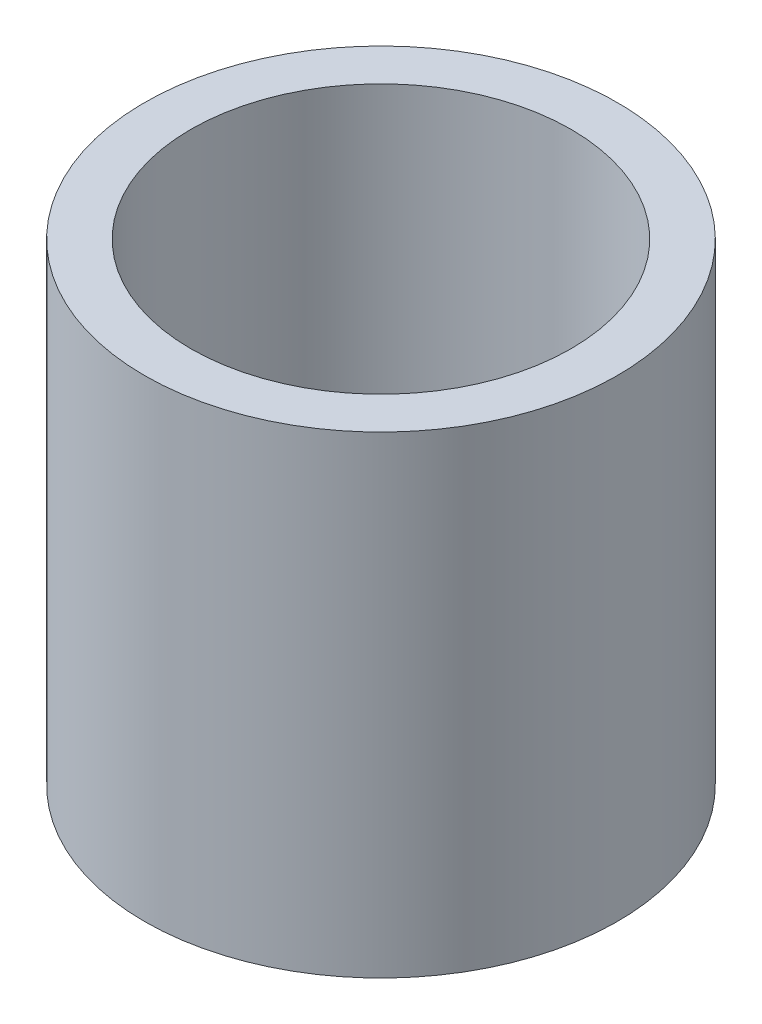
ISO-10303-21;
HEADER;
FILE_DESCRIPTION(('STEP AP214'),'2;1');
FILE_NAME('part.step','',(''),(''),'','','');
FILE_SCHEMA(('AUTOMOTIVE_DESIGN { 1 0 10303 214 1 1 1 1 }'));
ENDSEC;
DATA;
#1=APPLICATION_CONTEXT('core data for automotive mechanical design processes');
#2=APPLICATION_PROTOCOL_DEFINITION('international standard','automotive_design',2000,#1);
#3=PRODUCT_CONTEXT('',#1,'mechanical');
#4=PRODUCT('Part','Part','',(#3));
#5=PRODUCT_RELATED_PRODUCT_CATEGORY('part','',(#4));
#6=PRODUCT_DEFINITION_FORMATION('','',#4);
#7=PRODUCT_DEFINITION_CONTEXT('part definition',#1,'design');
#8=PRODUCT_DEFINITION('design','',#6,#7);
#9=PRODUCT_DEFINITION_SHAPE('','',#8);
#10=(LENGTH_UNIT() NAMED_UNIT(*) SI_UNIT(.MILLI.,.METRE.));
#11=(NAMED_UNIT(*) PLANE_ANGLE_UNIT() SI_UNIT($,.RADIAN.));
#12=(NAMED_UNIT(*) SI_UNIT($,.STERADIAN.) SOLID_ANGLE_UNIT());
#13=UNCERTAINTY_MEASURE_WITH_UNIT(LENGTH_MEASURE(1.E-05),#10,'distance_accuracy_value','');
#14=(GEOMETRIC_REPRESENTATION_CONTEXT(3) GLOBAL_UNCERTAINTY_ASSIGNED_CONTEXT((#13)) GLOBAL_UNIT_ASSIGNED_CONTEXT((#10,
#11,#12)) REPRESENTATION_CONTEXT('',''));
#15=CARTESIAN_POINT('',(0.,0.,0.));
#16=DIRECTION('',(0.,0.,1.));
#17=DIRECTION('',(1.,0.,0.));
#18=AXIS2_PLACEMENT_3D('',#15,#16,#17);
#19=CARTESIAN_POINT('',(0.,6.35,0.));
#20=DIRECTION('',(0.,-1.,0.));
#21=DIRECTION('',(0.,0.,-1.));
#22=AXIS2_PLACEMENT_3D('',#19,#20,#21);
#23=CYLINDRICAL_SURFACE('',#22,3.175);
#24=CARTESIAN_POINT('',(0.,6.35,0.));
#25=DIRECTION('',(0.,1.,0.));
#26=DIRECTION('',(0.,0.,1.));
#27=AXIS2_PLACEMENT_3D('',#24,#25,#26);
#28=CIRCLE('',#27,3.175);
#29=CARTESIAN_POINT('',(0.,6.35,3.175));
#30=VERTEX_POINT('',#29);
#31=EDGE_CURVE('E10',#30,#30,#28,.T.);
#32=ORIENTED_EDGE('',*,*,#31,.F.);
#33=EDGE_LOOP('',(#32));
#34=FACE_BOUND('',#33,.T.);
#35=CARTESIAN_POINT('',(0.,0.,0.));
#36=DIRECTION('',(0.,1.,0.));
#37=DIRECTION('',(0.,0.,1.));
#38=AXIS2_PLACEMENT_3D('',#35,#36,#37);
#39=CIRCLE('',#38,3.175);
#40=CARTESIAN_POINT('',(0.,0.,3.175));
#41=VERTEX_POINT('',#40);
#42=EDGE_CURVE('E45',#41,#41,#39,.T.);
#43=ORIENTED_EDGE('',*,*,#42,.T.);
#44=EDGE_LOOP('',(#43));
#45=FACE_BOUND('',#44,.T.);
#46=ADVANCED_FACE('F42',(#34,#45),#23,.T.);
#47=CARTESIAN_POINT('',(0.,6.35,0.));
#48=DIRECTION('',(0.,1.,0.));
#49=DIRECTION('',(0.,0.,1.));
#50=AXIS2_PLACEMENT_3D('',#47,#48,#49);
#51=PLANE('',#50);
#52=CARTESIAN_POINT('',(0.,6.35,0.));
#53=DIRECTION('',(0.,1.,0.));
#54=DIRECTION('',(0.,0.,1.));
#55=AXIS2_PLACEMENT_3D('',#52,#53,#54);
#56=CIRCLE('',#55,2.5527);
#57=CARTESIAN_POINT('',(0.,6.35,2.5527));
#58=VERTEX_POINT('',#57);
#59=EDGE_CURVE('E60',#58,#58,#56,.T.);
#60=ORIENTED_EDGE('',*,*,#59,.F.);
#61=EDGE_LOOP('',(#60));
#62=FACE_BOUND('',#61,.T.);
#63=ORIENTED_EDGE('',*,*,#31,.T.);
#64=EDGE_LOOP('',(#63));
#65=FACE_BOUND('',#64,.T.);
#66=ADVANCED_FACE('F68',(#62,#65),#51,.T.);
#67=CARTESIAN_POINT('',(0.,0.,0.));
#68=DIRECTION('',(0.,1.,0.));
#69=DIRECTION('',(0.,0.,1.));
#70=AXIS2_PLACEMENT_3D('',#67,#68,#69);
#71=PLANE('',#70);
#72=CARTESIAN_POINT('',(0.,0.,0.));
#73=DIRECTION('',(0.,1.,0.));
#74=DIRECTION('',(0.,0.,1.));
#75=AXIS2_PLACEMENT_3D('',#72,#73,#74);
#76=CIRCLE('',#75,2.5527);
#77=CARTESIAN_POINT('',(0.,0.,2.5527));
#78=VERTEX_POINT('',#77);
#79=EDGE_CURVE('E55',#78,#78,#76,.T.);
#80=ORIENTED_EDGE('',*,*,#79,.T.);
#81=EDGE_LOOP('',(#80));
#82=FACE_BOUND('',#81,.T.);
#83=ORIENTED_EDGE('',*,*,#42,.F.);
#84=EDGE_LOOP('',(#83));
#85=FACE_BOUND('',#84,.T.);
#86=ADVANCED_FACE('F70',(#82,#85),#71,.F.);
#87=CARTESIAN_POINT('',(0.,6.35,0.));
#88=DIRECTION('',(0.,1.,0.));
#89=DIRECTION('',(0.,0.,1.));
#90=AXIS2_PLACEMENT_3D('',#87,#88,#89);
#91=CYLINDRICAL_SURFACE('',#90,2.5527);
#92=ORIENTED_EDGE('',*,*,#79,.F.);
#93=EDGE_LOOP('',(#92));
#94=FACE_BOUND('',#93,.T.);
#95=ORIENTED_EDGE('',*,*,#59,.T.);
#96=EDGE_LOOP('',(#95));
#97=FACE_BOUND('',#96,.T.);
#98=ADVANCED_FACE('F66',(#94,#97),#91,.F.);
#99=CLOSED_SHELL('',(#46,#66,#86,#98));
#100=MANIFOLD_SOLID_BREP('B2',#99);
#101=ADVANCED_BREP_SHAPE_REPRESENTATION('',(#18,#100),#14);
#102=SHAPE_DEFINITION_REPRESENTATION(#9,#101);
ENDSEC;
END-ISO-10303-21;
